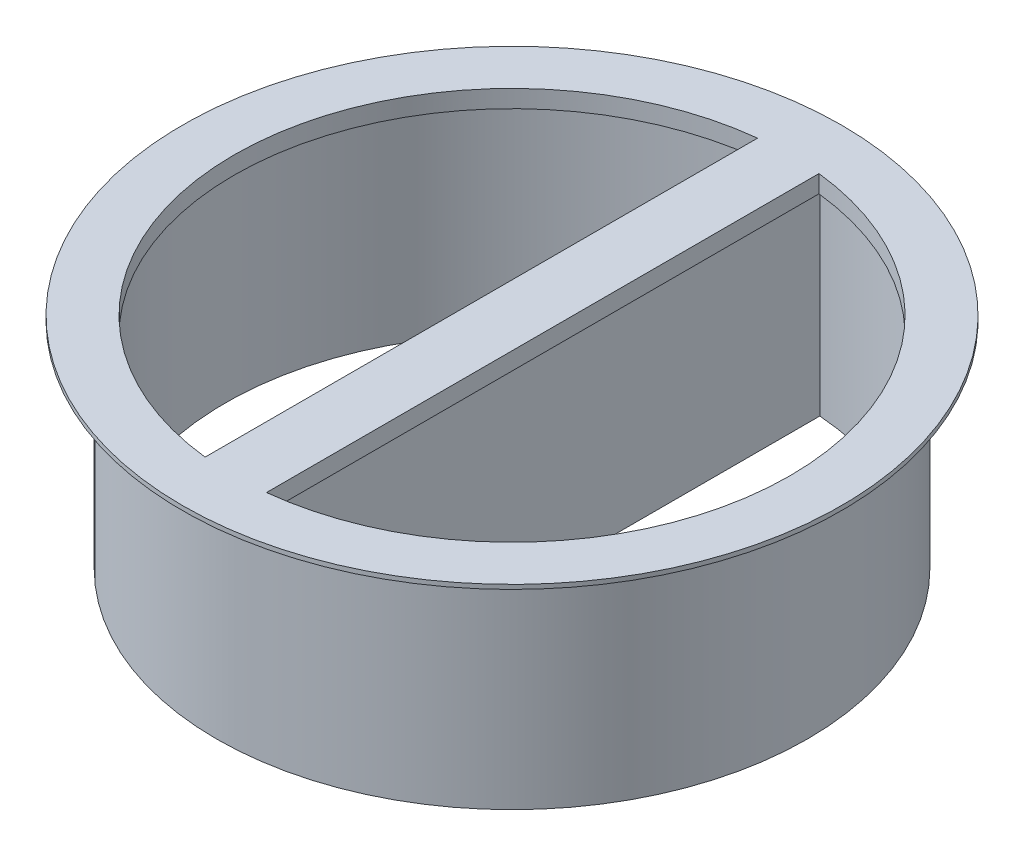
ISO-10303-21;
HEADER;
FILE_DESCRIPTION(('STEP AP214'),'2;1');
FILE_NAME('part.step','',(''),(''),'','','');
FILE_SCHEMA(('AUTOMOTIVE_DESIGN { 1 0 10303 214 1 1 1 1 }'));
ENDSEC;
DATA;
#1=APPLICATION_CONTEXT('core data for automotive mechanical design processes');
#2=APPLICATION_PROTOCOL_DEFINITION('international standard','automotive_design',2000,#1);
#3=PRODUCT_CONTEXT('',#1,'mechanical');
#4=PRODUCT('Part','Part','',(#3));
#5=PRODUCT_RELATED_PRODUCT_CATEGORY('part','',(#4));
#6=PRODUCT_DEFINITION_FORMATION('','',#4);
#7=PRODUCT_DEFINITION_CONTEXT('part definition',#1,'design');
#8=PRODUCT_DEFINITION('design','',#6,#7);
#9=PRODUCT_DEFINITION_SHAPE('','',#8);
#10=(LENGTH_UNIT() NAMED_UNIT(*) SI_UNIT(.MILLI.,.METRE.));
#11=(NAMED_UNIT(*) PLANE_ANGLE_UNIT() SI_UNIT($,.RADIAN.));
#12=(NAMED_UNIT(*) SI_UNIT($,.STERADIAN.) SOLID_ANGLE_UNIT());
#13=UNCERTAINTY_MEASURE_WITH_UNIT(LENGTH_MEASURE(1.E-05),#10,'distance_accuracy_value','');
#14=(GEOMETRIC_REPRESENTATION_CONTEXT(3) GLOBAL_UNCERTAINTY_ASSIGNED_CONTEXT((#13)) GLOBAL_UNIT_ASSIGNED_CONTEXT((#10,
#11,#12)) REPRESENTATION_CONTEXT('',''));
#15=CARTESIAN_POINT('',(0.,0.,0.));
#16=DIRECTION('',(0.,0.,1.));
#17=DIRECTION('',(1.,0.,0.));
#18=AXIS2_PLACEMENT_3D('',#15,#16,#17);
#19=CARTESIAN_POINT('',(0.,0.,0.));
#20=DIRECTION('',(0.,1.,0.));
#21=DIRECTION('',(0.,0.,1.));
#22=AXIS2_PLACEMENT_3D('',#19,#20,#21);
#23=CYLINDRICAL_SURFACE('',#22,31.7);
#24=CARTESIAN_POINT('',(0.,23.,0.));
#25=DIRECTION('',(0.,-1.,0.));
#26=DIRECTION('',(0.,0.,-1.));
#27=AXIS2_PLACEMENT_3D('',#24,#25,#26);
#28=CIRCLE('',#27,31.7);
#29=CARTESIAN_POINT('',(3.5,23.,31.5061898680244));
#30=VERTEX_POINT('',#29);
#31=CARTESIAN_POINT('',(3.5,23.,-31.5061898680244));
#32=VERTEX_POINT('',#31);
#33=EDGE_CURVE('E52',#30,#32,#28,.F.);
#34=ORIENTED_EDGE('',*,*,#33,.F.);
#35=DIRECTION('',(0.,1.,0.));
#36=VECTOR('',#35,1.);
#37=CARTESIAN_POINT('',(3.5,0.,31.5061898680244));
#38=LINE('',#37,#36);
#39=CARTESIAN_POINT('',(3.5,25.,31.5061898680244));
#40=VERTEX_POINT('',#39);
#41=EDGE_CURVE('E141',#30,#40,#38,.T.);
#42=ORIENTED_EDGE('',*,*,#41,.T.);
#43=CARTESIAN_POINT('',(0.,25.,0.));
#44=DIRECTION('',(0.,1.,0.));
#45=DIRECTION('',(0.,0.,1.));
#46=AXIS2_PLACEMENT_3D('',#43,#44,#45);
#47=CIRCLE('',#46,31.7);
#48=CARTESIAN_POINT('',(3.5,25.,-31.5061898680244));
#49=VERTEX_POINT('',#48);
#50=EDGE_CURVE('E134',#40,#49,#47,.T.);
#51=ORIENTED_EDGE('',*,*,#50,.T.);
#52=DIRECTION('',(0.,1.,0.));
#53=VECTOR('',#52,1.);
#54=CARTESIAN_POINT('',(3.5,0.,-31.5061898680244));
#55=LINE('',#54,#53);
#56=EDGE_CURVE('E140',#32,#49,#55,.T.);
#57=ORIENTED_EDGE('',*,*,#56,.F.);
#58=EDGE_LOOP('',(#34,#42,#51,#57));
#59=FACE_BOUND('',#58,.T.);
#60=ADVANCED_FACE('F31',(#59),#23,.F.);
#61=CARTESIAN_POINT('',(3.5,0.,-31.5061898680244));
#62=DIRECTION('',(-1.,0.,0.));
#63=DIRECTION('',(0.,0.,1.));
#64=AXIS2_PLACEMENT_3D('',#61,#62,#63);
#65=PLANE('',#64);
#66=DIRECTION('',(0.,0.,1.));
#67=VECTOR('',#66,1.);
#68=CARTESIAN_POINT('',(3.5,23.,-31.5061898680244));
#69=LINE('',#68,#67);
#70=EDGE_CURVE('E12',#32,#30,#69,.T.);
#71=ORIENTED_EDGE('',*,*,#70,.F.);
#72=ORIENTED_EDGE('',*,*,#56,.T.);
#73=DIRECTION('',(0.,0.,1.));
#74=VECTOR('',#73,1.);
#75=CARTESIAN_POINT('',(3.5,25.,-31.5061898680244));
#76=LINE('',#75,#74);
#77=EDGE_CURVE('E137',#49,#40,#76,.T.);
#78=ORIENTED_EDGE('',*,*,#77,.T.);
#79=ORIENTED_EDGE('',*,*,#41,.F.);
#80=EDGE_LOOP('',(#71,#72,#78,#79));
#81=FACE_BOUND('',#80,.T.);
#82=ADVANCED_FACE('F202',(#81),#65,.F.);
#83=CARTESIAN_POINT('',(0.,0.,0.));
#84=DIRECTION('',(0.,1.,0.));
#85=DIRECTION('',(0.,0.,1.));
#86=AXIS2_PLACEMENT_3D('',#83,#84,#85);
#87=CYLINDRICAL_SURFACE('',#86,31.7);
#88=CARTESIAN_POINT('',(0.,23.,0.));
#89=DIRECTION('',(0.,-1.,0.));
#90=DIRECTION('',(0.,0.,-1.));
#91=AXIS2_PLACEMENT_3D('',#88,#89,#90);
#92=CIRCLE('',#91,31.7);
#93=CARTESIAN_POINT('',(-3.5,23.,-31.5061898680244));
#94=VERTEX_POINT('',#93);
#95=CARTESIAN_POINT('',(-3.5,23.,31.5061898680244));
#96=VERTEX_POINT('',#95);
#97=EDGE_CURVE('E130',#94,#96,#92,.F.);
#98=ORIENTED_EDGE('',*,*,#97,.F.);
#99=DIRECTION('',(0.,1.,0.));
#100=VECTOR('',#99,1.);
#101=CARTESIAN_POINT('',(-3.5,0.,-31.5061898680244));
#102=LINE('',#101,#100);
#103=CARTESIAN_POINT('',(-3.5,25.,-31.5061898680244));
#104=VERTEX_POINT('',#103);
#105=EDGE_CURVE('E151',#94,#104,#102,.T.);
#106=ORIENTED_EDGE('',*,*,#105,.T.);
#107=CARTESIAN_POINT('',(0.,25.,0.));
#108=DIRECTION('',(0.,1.,0.));
#109=DIRECTION('',(0.,0.,1.));
#110=AXIS2_PLACEMENT_3D('',#107,#108,#109);
#111=CIRCLE('',#110,31.7);
#112=CARTESIAN_POINT('',(-3.5,25.,31.5061898680244));
#113=VERTEX_POINT('',#112);
#114=EDGE_CURVE('E143',#104,#113,#111,.T.);
#115=ORIENTED_EDGE('',*,*,#114,.T.);
#116=DIRECTION('',(0.,1.,0.));
#117=VECTOR('',#116,1.);
#118=CARTESIAN_POINT('',(-3.5,0.,31.5061898680244));
#119=LINE('',#118,#117);
#120=EDGE_CURVE('E150',#96,#113,#119,.T.);
#121=ORIENTED_EDGE('',*,*,#120,.F.);
#122=EDGE_LOOP('',(#98,#106,#115,#121));
#123=FACE_BOUND('',#122,.T.);
#124=ADVANCED_FACE('F173',(#123),#87,.F.);
#125=CARTESIAN_POINT('',(-3.5,0.,-31.5061898680244));
#126=DIRECTION('',(1.,0.,0.));
#127=DIRECTION('',(0.,0.,-1.));
#128=AXIS2_PLACEMENT_3D('',#125,#126,#127);
#129=PLANE('',#128);
#130=DIRECTION('',(0.,0.,-1.));
#131=VECTOR('',#130,1.);
#132=CARTESIAN_POINT('',(-3.5,23.,-31.5061898680244));
#133=LINE('',#132,#131);
#134=EDGE_CURVE('E39',#96,#94,#133,.T.);
#135=ORIENTED_EDGE('',*,*,#134,.F.);
#136=ORIENTED_EDGE('',*,*,#120,.T.);
#137=DIRECTION('',(0.,0.,-1.));
#138=VECTOR('',#137,1.);
#139=CARTESIAN_POINT('',(-3.5,25.,-31.5061898680244));
#140=LINE('',#139,#138);
#141=EDGE_CURVE('E147',#113,#104,#140,.T.);
#142=ORIENTED_EDGE('',*,*,#141,.T.);
#143=ORIENTED_EDGE('',*,*,#105,.F.);
#144=EDGE_LOOP('',(#135,#136,#142,#143));
#145=FACE_BOUND('',#144,.T.);
#146=ADVANCED_FACE('F174',(#145),#129,.F.);
#147=CARTESIAN_POINT('',(0.,25.,0.));
#148=DIRECTION('',(0.,-1.,0.));
#149=DIRECTION('',(0.,0.,-1.));
#150=AXIS2_PLACEMENT_3D('',#147,#148,#149);
#151=CYLINDRICAL_SURFACE('',#150,37.585);
#152=CARTESIAN_POINT('',(0.,25.,0.));
#153=DIRECTION('',(0.,1.,0.));
#154=DIRECTION('',(0.,0.,1.));
#155=AXIS2_PLACEMENT_3D('',#152,#153,#154);
#156=CIRCLE('',#155,37.585);
#157=CARTESIAN_POINT('',(0.,25.,37.585));
#158=VERTEX_POINT('',#157);
#159=EDGE_CURVE('E161',#158,#158,#156,.T.);
#160=ORIENTED_EDGE('',*,*,#159,.F.);
#161=EDGE_LOOP('',(#160));
#162=FACE_BOUND('',#161,.T.);
#163=CARTESIAN_POINT('',(0.,24.5,0.));
#164=DIRECTION('',(0.,-1.,0.));
#165=DIRECTION('',(0.,0.,-1.));
#166=AXIS2_PLACEMENT_3D('',#163,#164,#165);
#167=CIRCLE('',#166,37.585);
#168=CARTESIAN_POINT('',(0.,24.5,-37.585));
#169=VERTEX_POINT('',#168);
#170=EDGE_CURVE('E158',#169,#169,#167,.T.);
#171=ORIENTED_EDGE('',*,*,#170,.F.);
#172=EDGE_LOOP('',(#171));
#173=FACE_BOUND('',#172,.T.);
#174=ADVANCED_FACE('F33',(#162,#173),#151,.T.);
#175=CARTESIAN_POINT('',(0.,25.,0.));
#176=DIRECTION('',(0.,1.,0.));
#177=DIRECTION('',(0.,0.,1.));
#178=AXIS2_PLACEMENT_3D('',#175,#176,#177);
#179=PLANE('',#178);
#180=ORIENTED_EDGE('',*,*,#50,.F.);
#181=ORIENTED_EDGE('',*,*,#77,.F.);
#182=EDGE_LOOP('',(#180,#181));
#183=FACE_BOUND('',#182,.T.);
#184=ORIENTED_EDGE('',*,*,#114,.F.);
#185=ORIENTED_EDGE('',*,*,#141,.F.);
#186=EDGE_LOOP('',(#184,#185));
#187=FACE_BOUND('',#186,.T.);
#188=ORIENTED_EDGE('',*,*,#159,.T.);
#189=EDGE_LOOP('',(#188));
#190=FACE_BOUND('',#189,.T.);
#191=ADVANCED_FACE('F178',(#183,#187,#190),#179,.T.);
#192=CARTESIAN_POINT('',(0.,24.5,0.));
#193=DIRECTION('',(0.,-1.,0.));
#194=DIRECTION('',(0.,0.,-1.));
#195=AXIS2_PLACEMENT_3D('',#192,#193,#194);
#196=PLANE('',#195);
#197=CARTESIAN_POINT('',(0.,24.5,0.));
#198=DIRECTION('',(0.,-1.,0.));
#199=DIRECTION('',(0.,0.,-1.));
#200=AXIS2_PLACEMENT_3D('',#197,#198,#199);
#201=CIRCLE('',#200,33.7);
#202=CARTESIAN_POINT('',(0.,24.5,-33.7));
#203=VERTEX_POINT('',#202);
#204=EDGE_CURVE('E155',#203,#203,#201,.T.);
#205=ORIENTED_EDGE('',*,*,#204,.F.);
#206=EDGE_LOOP('',(#205));
#207=FACE_BOUND('',#206,.T.);
#208=ORIENTED_EDGE('',*,*,#170,.T.);
#209=EDGE_LOOP('',(#208));
#210=FACE_BOUND('',#209,.T.);
#211=ADVANCED_FACE('F181',(#207,#210),#196,.T.);
#212=CARTESIAN_POINT('',(0.,24.5,0.));
#213=DIRECTION('',(0.,-1.,0.));
#214=DIRECTION('',(0.,0.,-1.));
#215=AXIS2_PLACEMENT_3D('',#212,#213,#214);
#216=CYLINDRICAL_SURFACE('',#215,33.7);
#217=ORIENTED_EDGE('',*,*,#204,.T.);
#218=EDGE_LOOP('',(#217));
#219=FACE_BOUND('',#218,.T.);
#220=CARTESIAN_POINT('',(0.,0.,0.));
#221=DIRECTION('',(0.,-1.,0.));
#222=DIRECTION('',(0.,0.,-1.));
#223=AXIS2_PLACEMENT_3D('',#220,#221,#222);
#224=CIRCLE('',#223,33.7);
#225=CARTESIAN_POINT('',(0.,0.,-33.7));
#226=VERTEX_POINT('',#225);
#227=EDGE_CURVE('E153',#226,#226,#224,.T.);
#228=ORIENTED_EDGE('',*,*,#227,.F.);
#229=EDGE_LOOP('',(#228));
#230=FACE_BOUND('',#229,.T.);
#231=ADVANCED_FACE('F191',(#219,#230),#216,.T.);
#232=CARTESIAN_POINT('',(0.,0.,0.));
#233=DIRECTION('',(0.,1.,0.));
#234=DIRECTION('',(0.,0.,1.));
#235=AXIS2_PLACEMENT_3D('',#232,#233,#234);
#236=PLANE('',#235);
#237=DIRECTION('',(0.,0.,-1.));
#238=VECTOR('',#237,1.);
#239=CARTESIAN_POINT('',(2.50000000000001,0.,32.6042941957037));
#240=LINE('',#239,#238);
#241=CARTESIAN_POINT('',(2.50000000000001,0.,32.6042941957037));
#242=VERTEX_POINT('',#241);
#243=CARTESIAN_POINT('',(2.50000000000001,0.,-32.6042941957037));
#244=VERTEX_POINT('',#243);
#245=EDGE_CURVE('E107',#242,#244,#240,.T.);
#246=ORIENTED_EDGE('',*,*,#245,.F.);
#247=CARTESIAN_POINT('',(0.,0.,0.));
#248=DIRECTION('',(0.,-1.,0.));
#249=DIRECTION('',(0.,0.,-1.));
#250=AXIS2_PLACEMENT_3D('',#247,#248,#249);
#251=CIRCLE('',#250,32.7);
#252=EDGE_CURVE('E46',#244,#242,#251,.T.);
#253=ORIENTED_EDGE('',*,*,#252,.F.);
#254=EDGE_LOOP('',(#246,#253));
#255=FACE_BOUND('',#254,.T.);
#256=DIRECTION('',(0.,0.,1.));
#257=VECTOR('',#256,1.);
#258=CARTESIAN_POINT('',(-2.49999999999999,0.,32.6042941957037));
#259=LINE('',#258,#257);
#260=CARTESIAN_POINT('',(-2.49999999999999,0.,-32.6042941957037));
#261=VERTEX_POINT('',#260);
#262=CARTESIAN_POINT('',(-2.49999999999999,0.,32.6042941957037));
#263=VERTEX_POINT('',#262);
#264=EDGE_CURVE('E121',#261,#263,#259,.T.);
#265=ORIENTED_EDGE('',*,*,#264,.F.);
#266=CARTESIAN_POINT('',(0.,0.,0.));
#267=DIRECTION('',(0.,-1.,0.));
#268=DIRECTION('',(0.,0.,-1.));
#269=AXIS2_PLACEMENT_3D('',#266,#267,#268);
#270=CIRCLE('',#269,32.7);
#271=EDGE_CURVE('E116',#263,#261,#270,.T.);
#272=ORIENTED_EDGE('',*,*,#271,.F.);
#273=EDGE_LOOP('',(#265,#272));
#274=FACE_BOUND('',#273,.T.);
#275=ORIENTED_EDGE('',*,*,#227,.T.);
#276=EDGE_LOOP('',(#275));
#277=FACE_BOUND('',#276,.T.);
#278=ADVANCED_FACE('F197',(#255,#274,#277),#236,.F.);
#279=CARTESIAN_POINT('',(0.,23.,0.));
#280=DIRECTION('',(0.,-1.,0.));
#281=DIRECTION('',(0.,0.,-1.));
#282=AXIS2_PLACEMENT_3D('',#279,#280,#281);
#283=PLANE('',#282);
#284=CARTESIAN_POINT('',(0.,23.,0.));
#285=DIRECTION('',(0.,-1.,0.));
#286=DIRECTION('',(0.,0.,-1.));
#287=AXIS2_PLACEMENT_3D('',#284,#285,#286);
#288=CIRCLE('',#287,32.7);
#289=CARTESIAN_POINT('',(-2.49999999999999,23.,32.6042941957037));
#290=VERTEX_POINT('',#289);
#291=CARTESIAN_POINT('',(-2.49999999999999,23.,-32.6042941957037));
#292=VERTEX_POINT('',#291);
#293=EDGE_CURVE('E117',#290,#292,#288,.T.);
#294=ORIENTED_EDGE('',*,*,#293,.T.);
#295=DIRECTION('',(0.,0.,1.));
#296=VECTOR('',#295,1.);
#297=CARTESIAN_POINT('',(-2.49999999999999,23.,32.6042941957037));
#298=LINE('',#297,#296);
#299=EDGE_CURVE('E120',#292,#290,#298,.T.);
#300=ORIENTED_EDGE('',*,*,#299,.T.);
#301=EDGE_LOOP('',(#294,#300));
#302=FACE_BOUND('',#301,.T.);
#303=ORIENTED_EDGE('',*,*,#97,.T.);
#304=ORIENTED_EDGE('',*,*,#134,.T.);
#305=EDGE_LOOP('',(#303,#304));
#306=FACE_BOUND('',#305,.T.);
#307=ADVANCED_FACE('F168',(#302,#306),#283,.T.);
#308=CARTESIAN_POINT('',(0.,23.,0.));
#309=DIRECTION('',(0.,-1.,0.));
#310=DIRECTION('',(0.,0.,-1.));
#311=AXIS2_PLACEMENT_3D('',#308,#309,#310);
#312=CYLINDRICAL_SURFACE('',#311,32.7);
#313=ORIENTED_EDGE('',*,*,#271,.T.);
#314=DIRECTION('',(0.,-1.,0.));
#315=VECTOR('',#314,1.);
#316=CARTESIAN_POINT('',(-2.49999999999999,23.,-32.6042941957037));
#317=LINE('',#316,#315);
#318=EDGE_CURVE('E124',#292,#261,#317,.T.);
#319=ORIENTED_EDGE('',*,*,#318,.F.);
#320=ORIENTED_EDGE('',*,*,#293,.F.);
#321=DIRECTION('',(0.,-1.,0.));
#322=VECTOR('',#321,1.);
#323=CARTESIAN_POINT('',(-2.49999999999999,23.,32.6042941957037));
#324=LINE('',#323,#322);
#325=EDGE_CURVE('E128',#290,#263,#324,.T.);
#326=ORIENTED_EDGE('',*,*,#325,.T.);
#327=EDGE_LOOP('',(#313,#319,#320,#326));
#328=FACE_BOUND('',#327,.T.);
#329=ADVANCED_FACE('F271',(#328),#312,.F.);
#330=CARTESIAN_POINT('',(-2.49999999999999,23.,32.6042941957037));
#331=DIRECTION('',(1.,0.,0.));
#332=DIRECTION('',(0.,0.,-1.));
#333=AXIS2_PLACEMENT_3D('',#330,#331,#332);
#334=PLANE('',#333);
#335=ORIENTED_EDGE('',*,*,#264,.T.);
#336=ORIENTED_EDGE('',*,*,#325,.F.);
#337=ORIENTED_EDGE('',*,*,#299,.F.);
#338=ORIENTED_EDGE('',*,*,#318,.T.);
#339=EDGE_LOOP('',(#335,#336,#337,#338));
#340=FACE_BOUND('',#339,.T.);
#341=ADVANCED_FACE('F281',(#340),#334,.F.);
#342=CARTESIAN_POINT('',(0.,23.,0.));
#343=DIRECTION('',(0.,-1.,0.));
#344=DIRECTION('',(0.,0.,-1.));
#345=AXIS2_PLACEMENT_3D('',#342,#343,#344);
#346=PLANE('',#345);
#347=CARTESIAN_POINT('',(0.,23.,0.));
#348=DIRECTION('',(0.,-1.,0.));
#349=DIRECTION('',(0.,0.,-1.));
#350=AXIS2_PLACEMENT_3D('',#347,#348,#349);
#351=CIRCLE('',#350,32.7);
#352=CARTESIAN_POINT('',(2.50000000000001,23.,-32.6042941957037));
#353=VERTEX_POINT('',#352);
#354=CARTESIAN_POINT('',(2.50000000000001,23.,32.6042941957037));
#355=VERTEX_POINT('',#354);
#356=EDGE_CURVE('E96',#353,#355,#351,.T.);
#357=ORIENTED_EDGE('',*,*,#356,.T.);
#358=DIRECTION('',(0.,0.,-1.));
#359=VECTOR('',#358,1.);
#360=CARTESIAN_POINT('',(2.50000000000001,23.,32.6042941957037));
#361=LINE('',#360,#359);
#362=EDGE_CURVE('E103',#355,#353,#361,.T.);
#363=ORIENTED_EDGE('',*,*,#362,.T.);
#364=EDGE_LOOP('',(#357,#363));
#365=FACE_BOUND('',#364,.T.);
#366=ORIENTED_EDGE('',*,*,#33,.T.);
#367=ORIENTED_EDGE('',*,*,#70,.T.);
#368=EDGE_LOOP('',(#366,#367));
#369=FACE_BOUND('',#368,.T.);
#370=ADVANCED_FACE('F106',(#365,#369),#346,.T.);
#371=CARTESIAN_POINT('',(0.,23.,0.));
#372=DIRECTION('',(0.,-1.,0.));
#373=DIRECTION('',(0.,0.,-1.));
#374=AXIS2_PLACEMENT_3D('',#371,#372,#373);
#375=CYLINDRICAL_SURFACE('',#374,32.7);
#376=ORIENTED_EDGE('',*,*,#252,.T.);
#377=DIRECTION('',(0.,-1.,0.));
#378=VECTOR('',#377,1.);
#379=CARTESIAN_POINT('',(2.50000000000001,23.,32.6042941957037));
#380=LINE('',#379,#378);
#381=EDGE_CURVE('E93',#355,#242,#380,.T.);
#382=ORIENTED_EDGE('',*,*,#381,.F.);
#383=ORIENTED_EDGE('',*,*,#356,.F.);
#384=DIRECTION('',(0.,-1.,0.));
#385=VECTOR('',#384,1.);
#386=CARTESIAN_POINT('',(2.50000000000001,23.,-32.6042941957037));
#387=LINE('',#386,#385);
#388=EDGE_CURVE('E102',#353,#244,#387,.T.);
#389=ORIENTED_EDGE('',*,*,#388,.T.);
#390=EDGE_LOOP('',(#376,#382,#383,#389));
#391=FACE_BOUND('',#390,.T.);
#392=ADVANCED_FACE('F95',(#391),#375,.F.);
#393=CARTESIAN_POINT('',(2.50000000000001,23.,32.6042941957037));
#394=DIRECTION('',(-1.,0.,0.));
#395=DIRECTION('',(0.,0.,1.));
#396=AXIS2_PLACEMENT_3D('',#393,#394,#395);
#397=PLANE('',#396);
#398=ORIENTED_EDGE('',*,*,#245,.T.);
#399=ORIENTED_EDGE('',*,*,#388,.F.);
#400=ORIENTED_EDGE('',*,*,#362,.F.);
#401=ORIENTED_EDGE('',*,*,#381,.T.);
#402=EDGE_LOOP('',(#398,#399,#400,#401));
#403=FACE_BOUND('',#402,.T.);
#404=ADVANCED_FACE('F109',(#403),#397,.F.);
#405=CLOSED_SHELL('',(#60,#82,#124,#146,#174,#191,#211,#231,#278,#307,#329,#341,#370,#392,#404));
#406=MANIFOLD_SOLID_BREP('B2',#405);
#407=ADVANCED_BREP_SHAPE_REPRESENTATION('',(#18,#406),#14);
#408=SHAPE_DEFINITION_REPRESENTATION(#9,#407);
ENDSEC;
END-ISO-10303-21;
